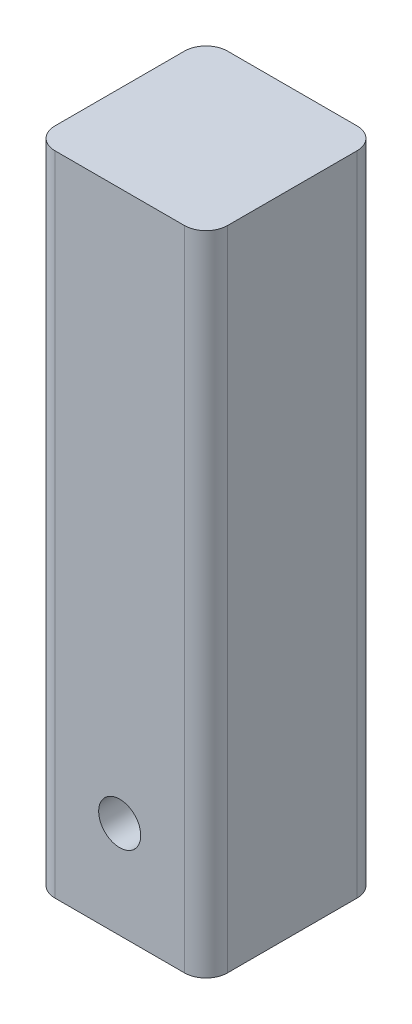
ISO-10303-21;
HEADER;
FILE_DESCRIPTION(('STEP AP214'),'2;1');
FILE_NAME('part.step','',(''),(''),'','','');
FILE_SCHEMA(('AUTOMOTIVE_DESIGN { 1 0 10303 214 1 1 1 1 }'));
ENDSEC;
DATA;
#1=APPLICATION_CONTEXT('core data for automotive mechanical design processes');
#2=APPLICATION_PROTOCOL_DEFINITION('international standard','automotive_design',2000,#1);
#3=PRODUCT_CONTEXT('',#1,'mechanical');
#4=PRODUCT('Part','Part','',(#3));
#5=PRODUCT_RELATED_PRODUCT_CATEGORY('part','',(#4));
#6=PRODUCT_DEFINITION_FORMATION('','',#4);
#7=PRODUCT_DEFINITION_CONTEXT('part definition',#1,'design');
#8=PRODUCT_DEFINITION('design','',#6,#7);
#9=PRODUCT_DEFINITION_SHAPE('','',#8);
#10=(LENGTH_UNIT() NAMED_UNIT(*) SI_UNIT(.MILLI.,.METRE.));
#11=(NAMED_UNIT(*) PLANE_ANGLE_UNIT() SI_UNIT($,.RADIAN.));
#12=(NAMED_UNIT(*) SI_UNIT($,.STERADIAN.) SOLID_ANGLE_UNIT());
#13=UNCERTAINTY_MEASURE_WITH_UNIT(LENGTH_MEASURE(1.E-05),#10,'distance_accuracy_value','');
#14=(GEOMETRIC_REPRESENTATION_CONTEXT(3) GLOBAL_UNCERTAINTY_ASSIGNED_CONTEXT((#13)) GLOBAL_UNIT_ASSIGNED_CONTEXT((#10,
#11,#12)) REPRESENTATION_CONTEXT('',''));
#15=CARTESIAN_POINT('',(0.,0.,0.));
#16=DIRECTION('',(0.,0.,1.));
#17=DIRECTION('',(1.,0.,0.));
#18=AXIS2_PLACEMENT_3D('',#15,#16,#17);
#19=CARTESIAN_POINT('',(-44.8369966945449,120.,-11.4563106796114));
#20=DIRECTION('',(0.,-1.,0.));
#21=DIRECTION('',(0.,0.,-1.));
#22=AXIS2_PLACEMENT_3D('',#19,#20,#21);
#23=CYLINDRICAL_SURFACE('',#22,4.);
#24=CARTESIAN_POINT('',(-44.8369966945449,0.,-11.4563106796114));
#25=DIRECTION('',(0.,1.,0.));
#26=DIRECTION('',(0.,0.,1.));
#27=AXIS2_PLACEMENT_3D('',#24,#25,#26);
#28=CIRCLE('',#27,4.);
#29=CARTESIAN_POINT('',(-44.8369966945449,0.,-15.4563106796114));
#30=VERTEX_POINT('',#29);
#31=CARTESIAN_POINT('',(-48.8369966945449,0.,-11.4563106796114));
#32=VERTEX_POINT('',#31);
#33=EDGE_CURVE('E133',#30,#32,#28,.T.);
#34=ORIENTED_EDGE('',*,*,#33,.T.);
#35=DIRECTION('',(0.,-1.,0.));
#36=VECTOR('',#35,1.);
#37=CARTESIAN_POINT('',(-48.8369966945449,120.,-11.4563106796114));
#38=LINE('',#37,#36);
#39=CARTESIAN_POINT('',(-48.8369966945449,120.,-11.4563106796114));
#40=VERTEX_POINT('',#39);
#41=EDGE_CURVE('E11',#40,#32,#38,.T.);
#42=ORIENTED_EDGE('',*,*,#41,.F.);
#43=CARTESIAN_POINT('',(-44.8369966945449,120.,-11.4563106796114));
#44=DIRECTION('',(0.,1.,0.));
#45=DIRECTION('',(0.,0.,1.));
#46=AXIS2_PLACEMENT_3D('',#43,#44,#45);
#47=CIRCLE('',#46,4.);
#48=CARTESIAN_POINT('',(-44.8369966945449,120.,-15.4563106796114));
#49=VERTEX_POINT('',#48);
#50=EDGE_CURVE('E147',#49,#40,#47,.T.);
#51=ORIENTED_EDGE('',*,*,#50,.F.);
#52=DIRECTION('',(0.,-1.,0.));
#53=VECTOR('',#52,1.);
#54=CARTESIAN_POINT('',(-44.8369966945449,120.,-15.4563106796114));
#55=LINE('',#54,#53);
#56=EDGE_CURVE('E132',#49,#30,#55,.T.);
#57=ORIENTED_EDGE('',*,*,#56,.T.);
#58=EDGE_LOOP('',(#34,#42,#51,#57));
#59=FACE_BOUND('',#58,.T.);
#60=ADVANCED_FACE('F39',(#59),#23,.T.);
#61=CARTESIAN_POINT('',(-48.8369966945449,120.,-11.4563106796114));
#62=DIRECTION('',(1.,0.,0.));
#63=DIRECTION('',(0.,0.,-1.));
#64=AXIS2_PLACEMENT_3D('',#61,#62,#63);
#65=PLANE('',#64);
#66=DIRECTION('',(0.,0.,1.));
#67=VECTOR('',#66,1.);
#68=CARTESIAN_POINT('',(-48.8369966945449,0.,-11.4563106796114));
#69=LINE('',#68,#67);
#70=CARTESIAN_POINT('',(-48.8369966945449,0.,12.5436893203886));
#71=VERTEX_POINT('',#70);
#72=EDGE_CURVE('E139',#32,#71,#69,.T.);
#73=ORIENTED_EDGE('',*,*,#72,.T.);
#74=DIRECTION('',(0.,-1.,0.));
#75=VECTOR('',#74,1.);
#76=CARTESIAN_POINT('',(-48.8369966945449,120.,12.5436893203886));
#77=LINE('',#76,#75);
#78=CARTESIAN_POINT('',(-48.8369966945449,120.,12.5436893203886));
#79=VERTEX_POINT('',#78);
#80=EDGE_CURVE('E50',#79,#71,#77,.T.);
#81=ORIENTED_EDGE('',*,*,#80,.F.);
#82=DIRECTION('',(0.,0.,1.));
#83=VECTOR('',#82,1.);
#84=CARTESIAN_POINT('',(-48.8369966945449,120.,-11.4563106796114));
#85=LINE('',#84,#83);
#86=EDGE_CURVE('E98',#40,#79,#85,.T.);
#87=ORIENTED_EDGE('',*,*,#86,.F.);
#88=ORIENTED_EDGE('',*,*,#41,.T.);
#89=EDGE_LOOP('',(#73,#81,#87,#88));
#90=FACE_BOUND('',#89,.T.);
#91=ADVANCED_FACE('F206',(#90),#65,.F.);
#92=CARTESIAN_POINT('',(-44.8369966945449,120.,12.5436893203886));
#93=DIRECTION('',(0.,-1.,0.));
#94=DIRECTION('',(0.,0.,-1.));
#95=AXIS2_PLACEMENT_3D('',#92,#93,#94);
#96=CYLINDRICAL_SURFACE('',#95,4.);
#97=CARTESIAN_POINT('',(-44.8369966945449,0.,12.5436893203886));
#98=DIRECTION('',(0.,1.,0.));
#99=DIRECTION('',(0.,0.,1.));
#100=AXIS2_PLACEMENT_3D('',#97,#98,#99);
#101=CIRCLE('',#100,4.);
#102=CARTESIAN_POINT('',(-44.8369966945449,0.,16.5436893203886));
#103=VERTEX_POINT('',#102);
#104=EDGE_CURVE('E143',#71,#103,#101,.T.);
#105=ORIENTED_EDGE('',*,*,#104,.T.);
#106=DIRECTION('',(0.,-1.,0.));
#107=VECTOR('',#106,1.);
#108=CARTESIAN_POINT('',(-44.8369966945449,120.,16.5436893203886));
#109=LINE('',#108,#107);
#110=CARTESIAN_POINT('',(-44.8369966945449,120.,16.5436893203886));
#111=VERTEX_POINT('',#110);
#112=EDGE_CURVE('E160',#111,#103,#109,.T.);
#113=ORIENTED_EDGE('',*,*,#112,.F.);
#114=CARTESIAN_POINT('',(-44.8369966945449,120.,12.5436893203886));
#115=DIRECTION('',(0.,1.,0.));
#116=DIRECTION('',(0.,0.,1.));
#117=AXIS2_PLACEMENT_3D('',#114,#115,#116);
#118=CIRCLE('',#117,4.);
#119=EDGE_CURVE('E164',#79,#111,#118,.T.);
#120=ORIENTED_EDGE('',*,*,#119,.F.);
#121=ORIENTED_EDGE('',*,*,#80,.T.);
#122=EDGE_LOOP('',(#105,#113,#120,#121));
#123=FACE_BOUND('',#122,.T.);
#124=ADVANCED_FACE('F162',(#123),#96,.T.);
#125=CARTESIAN_POINT('',(-44.8369966945449,120.,16.5436893203886));
#126=DIRECTION('',(0.,0.,-1.));
#127=DIRECTION('',(-1.,0.,0.));
#128=AXIS2_PLACEMENT_3D('',#125,#126,#127);
#129=PLANE('',#128);
#130=CARTESIAN_POINT('',(-32.8369966945449,18.,16.5436893203886));
#131=DIRECTION('',(0.,0.,1.));
#132=DIRECTION('',(1.,0.,0.));
#133=AXIS2_PLACEMENT_3D('',#130,#131,#132);
#134=CIRCLE('',#133,3.9);
#135=CARTESIAN_POINT('',(-28.9369966945449,18.,16.5436893203886));
#136=VERTEX_POINT('',#135);
#137=EDGE_CURVE('E181',#136,#136,#134,.T.);
#138=ORIENTED_EDGE('',*,*,#137,.F.);
#139=EDGE_LOOP('',(#138));
#140=FACE_BOUND('',#139,.T.);
#141=DIRECTION('',(1.,0.,0.));
#142=VECTOR('',#141,1.);
#143=CARTESIAN_POINT('',(-44.8369966945449,0.,16.5436893203886));
#144=LINE('',#143,#142);
#145=CARTESIAN_POINT('',(-20.836996694545,0.,16.5436893203886));
#146=VERTEX_POINT('',#145);
#147=EDGE_CURVE('E141',#103,#146,#144,.T.);
#148=ORIENTED_EDGE('',*,*,#147,.T.);
#149=DIRECTION('',(0.,-1.,0.));
#150=VECTOR('',#149,1.);
#151=CARTESIAN_POINT('',(-20.836996694545,120.,16.5436893203886));
#152=LINE('',#151,#150);
#153=CARTESIAN_POINT('',(-20.836996694545,120.,16.5436893203886));
#154=VERTEX_POINT('',#153);
#155=EDGE_CURVE('E152',#154,#146,#152,.T.);
#156=ORIENTED_EDGE('',*,*,#155,.F.);
#157=DIRECTION('',(1.,0.,0.));
#158=VECTOR('',#157,1.);
#159=CARTESIAN_POINT('',(-44.8369966945449,120.,16.5436893203886));
#160=LINE('',#159,#158);
#161=EDGE_CURVE('E180',#111,#154,#160,.T.);
#162=ORIENTED_EDGE('',*,*,#161,.F.);
#163=ORIENTED_EDGE('',*,*,#112,.T.);
#164=EDGE_LOOP('',(#148,#156,#162,#163));
#165=FACE_BOUND('',#164,.T.);
#166=ADVANCED_FACE('F174',(#140,#165),#129,.F.);
#167=CARTESIAN_POINT('',(-20.8369966945449,120.,12.5436893203886));
#168=DIRECTION('',(0.,-1.,0.));
#169=DIRECTION('',(0.,0.,-1.));
#170=AXIS2_PLACEMENT_3D('',#167,#168,#169);
#171=CYLINDRICAL_SURFACE('',#170,4.);
#172=CARTESIAN_POINT('',(-20.8369966945449,0.,12.5436893203886));
#173=DIRECTION('',(0.,1.,0.));
#174=DIRECTION('',(0.,0.,-1.));
#175=AXIS2_PLACEMENT_3D('',#172,#173,#174);
#176=CIRCLE('',#175,4.);
#177=CARTESIAN_POINT('',(-16.8369966945449,0.,12.5436893203886));
#178=VERTEX_POINT('',#177);
#179=EDGE_CURVE('E144',#146,#178,#176,.T.);
#180=ORIENTED_EDGE('',*,*,#179,.T.);
#181=DIRECTION('',(0.,-1.,0.));
#182=VECTOR('',#181,1.);
#183=CARTESIAN_POINT('',(-16.8369966945449,120.,12.5436893203886));
#184=LINE('',#183,#182);
#185=CARTESIAN_POINT('',(-16.8369966945449,120.,12.5436893203886));
#186=VERTEX_POINT('',#185);
#187=EDGE_CURVE('E127',#186,#178,#184,.T.);
#188=ORIENTED_EDGE('',*,*,#187,.F.);
#189=CARTESIAN_POINT('',(-20.8369966945449,120.,12.5436893203886));
#190=DIRECTION('',(0.,1.,0.));
#191=DIRECTION('',(0.,0.,-1.));
#192=AXIS2_PLACEMENT_3D('',#189,#190,#191);
#193=CIRCLE('',#192,4.);
#194=EDGE_CURVE('E120',#154,#186,#193,.T.);
#195=ORIENTED_EDGE('',*,*,#194,.F.);
#196=ORIENTED_EDGE('',*,*,#155,.T.);
#197=EDGE_LOOP('',(#180,#188,#195,#196));
#198=FACE_BOUND('',#197,.T.);
#199=ADVANCED_FACE('F177',(#198),#171,.T.);
#200=CARTESIAN_POINT('',(-16.8369966945449,120.,-11.4563106796114));
#201=DIRECTION('',(-1.,0.,0.));
#202=DIRECTION('',(0.,0.,1.));
#203=AXIS2_PLACEMENT_3D('',#200,#201,#202);
#204=PLANE('',#203);
#205=DIRECTION('',(0.,0.,-1.));
#206=VECTOR('',#205,1.);
#207=CARTESIAN_POINT('',(-16.8369966945449,0.,-11.4563106796114));
#208=LINE('',#207,#206);
#209=CARTESIAN_POINT('',(-16.8369966945449,0.,-11.4563106796114));
#210=VERTEX_POINT('',#209);
#211=EDGE_CURVE('E123',#178,#210,#208,.T.);
#212=ORIENTED_EDGE('',*,*,#211,.T.);
#213=DIRECTION('',(0.,-1.,0.));
#214=VECTOR('',#213,1.);
#215=CARTESIAN_POINT('',(-16.8369966945449,120.,-11.4563106796114));
#216=LINE('',#215,#214);
#217=CARTESIAN_POINT('',(-16.8369966945449,120.,-11.4563106796114));
#218=VERTEX_POINT('',#217);
#219=EDGE_CURVE('E125',#218,#210,#216,.T.);
#220=ORIENTED_EDGE('',*,*,#219,.F.);
#221=DIRECTION('',(0.,0.,-1.));
#222=VECTOR('',#221,1.);
#223=CARTESIAN_POINT('',(-16.8369966945449,120.,-11.4563106796114));
#224=LINE('',#223,#222);
#225=EDGE_CURVE('E112',#186,#218,#224,.T.);
#226=ORIENTED_EDGE('',*,*,#225,.F.);
#227=ORIENTED_EDGE('',*,*,#187,.T.);
#228=EDGE_LOOP('',(#212,#220,#226,#227));
#229=FACE_BOUND('',#228,.T.);
#230=ADVANCED_FACE('F124',(#229),#204,.F.);
#231=CARTESIAN_POINT('',(-20.8369966945449,120.,-11.4563106796114));
#232=DIRECTION('',(0.,-1.,0.));
#233=DIRECTION('',(0.,0.,-1.));
#234=AXIS2_PLACEMENT_3D('',#231,#232,#233);
#235=CYLINDRICAL_SURFACE('',#234,4.);
#236=CARTESIAN_POINT('',(-20.8369966945449,0.,-11.4563106796114));
#237=DIRECTION('',(0.,1.,0.));
#238=DIRECTION('',(0.,0.,1.));
#239=AXIS2_PLACEMENT_3D('',#236,#237,#238);
#240=CIRCLE('',#239,4.);
#241=CARTESIAN_POINT('',(-20.836996694545,0.,-15.4563106796114));
#242=VERTEX_POINT('',#241);
#243=EDGE_CURVE('E81',#210,#242,#240,.T.);
#244=ORIENTED_EDGE('',*,*,#243,.T.);
#245=DIRECTION('',(0.,-1.,0.));
#246=VECTOR('',#245,1.);
#247=CARTESIAN_POINT('',(-20.836996694545,120.,-15.4563106796114));
#248=LINE('',#247,#246);
#249=CARTESIAN_POINT('',(-20.836996694545,120.,-15.4563106796114));
#250=VERTEX_POINT('',#249);
#251=EDGE_CURVE('E130',#250,#242,#248,.T.);
#252=ORIENTED_EDGE('',*,*,#251,.F.);
#253=CARTESIAN_POINT('',(-20.8369966945449,120.,-11.4563106796114));
#254=DIRECTION('',(0.,1.,0.));
#255=DIRECTION('',(0.,0.,1.));
#256=AXIS2_PLACEMENT_3D('',#253,#254,#255);
#257=CIRCLE('',#256,4.);
#258=EDGE_CURVE('E113',#218,#250,#257,.T.);
#259=ORIENTED_EDGE('',*,*,#258,.F.);
#260=ORIENTED_EDGE('',*,*,#219,.T.);
#261=EDGE_LOOP('',(#244,#252,#259,#260));
#262=FACE_BOUND('',#261,.T.);
#263=ADVANCED_FACE('F129',(#262),#235,.T.);
#264=CARTESIAN_POINT('',(-44.8369966945449,120.,-15.4563106796114));
#265=DIRECTION('',(0.,0.,1.));
#266=DIRECTION('',(1.,0.,0.));
#267=AXIS2_PLACEMENT_3D('',#264,#265,#266);
#268=PLANE('',#267);
#269=CARTESIAN_POINT('',(-32.8369966945449,18.,-15.4563106796114));
#270=DIRECTION('',(0.,0.,1.));
#271=DIRECTION('',(1.,0.,0.));
#272=AXIS2_PLACEMENT_3D('',#269,#270,#271);
#273=CIRCLE('',#272,3.9);
#274=CARTESIAN_POINT('',(-28.9369966945449,18.,-15.4563106796114));
#275=VERTEX_POINT('',#274);
#276=EDGE_CURVE('E136',#275,#275,#273,.T.);
#277=ORIENTED_EDGE('',*,*,#276,.T.);
#278=EDGE_LOOP('',(#277));
#279=FACE_BOUND('',#278,.T.);
#280=DIRECTION('',(-1.,0.,0.));
#281=VECTOR('',#280,1.);
#282=CARTESIAN_POINT('',(-44.8369966945449,0.,-15.4563106796114));
#283=LINE('',#282,#281);
#284=EDGE_CURVE('E89',#242,#30,#283,.T.);
#285=ORIENTED_EDGE('',*,*,#284,.T.);
#286=ORIENTED_EDGE('',*,*,#56,.F.);
#287=DIRECTION('',(-1.,0.,0.));
#288=VECTOR('',#287,1.);
#289=CARTESIAN_POINT('',(-44.8369966945449,120.,-15.4563106796114));
#290=LINE('',#289,#288);
#291=EDGE_CURVE('E54',#250,#49,#290,.T.);
#292=ORIENTED_EDGE('',*,*,#291,.F.);
#293=ORIENTED_EDGE('',*,*,#251,.T.);
#294=EDGE_LOOP('',(#285,#286,#292,#293));
#295=FACE_BOUND('',#294,.T.);
#296=ADVANCED_FACE('F186',(#279,#295),#268,.F.);
#297=CARTESIAN_POINT('',(-44.8369966945449,120.,-11.4563106796114));
#298=DIRECTION('',(0.,1.,0.));
#299=DIRECTION('',(0.,0.,1.));
#300=AXIS2_PLACEMENT_3D('',#297,#298,#299);
#301=PLANE('',#300);
#302=ORIENTED_EDGE('',*,*,#50,.T.);
#303=ORIENTED_EDGE('',*,*,#86,.T.);
#304=ORIENTED_EDGE('',*,*,#119,.T.);
#305=ORIENTED_EDGE('',*,*,#161,.T.);
#306=ORIENTED_EDGE('',*,*,#194,.T.);
#307=ORIENTED_EDGE('',*,*,#225,.T.);
#308=ORIENTED_EDGE('',*,*,#258,.T.);
#309=ORIENTED_EDGE('',*,*,#291,.T.);
#310=EDGE_LOOP('',(#302,#303,#304,#305,#306,#307,#308,#309));
#311=FACE_BOUND('',#310,.T.);
#312=ADVANCED_FACE('F114',(#311),#301,.T.);
#313=CARTESIAN_POINT('',(-44.8369966945449,0.,-11.4563106796114));
#314=DIRECTION('',(0.,1.,0.));
#315=DIRECTION('',(0.,0.,1.));
#316=AXIS2_PLACEMENT_3D('',#313,#314,#315);
#317=PLANE('',#316);
#318=ORIENTED_EDGE('',*,*,#33,.F.);
#319=ORIENTED_EDGE('',*,*,#284,.F.);
#320=ORIENTED_EDGE('',*,*,#243,.F.);
#321=ORIENTED_EDGE('',*,*,#211,.F.);
#322=ORIENTED_EDGE('',*,*,#179,.F.);
#323=ORIENTED_EDGE('',*,*,#147,.F.);
#324=ORIENTED_EDGE('',*,*,#104,.F.);
#325=ORIENTED_EDGE('',*,*,#72,.F.);
#326=EDGE_LOOP('',(#318,#319,#320,#321,#322,#323,#324,#325));
#327=FACE_BOUND('',#326,.T.);
#328=ADVANCED_FACE('F166',(#327),#317,.F.);
#329=CARTESIAN_POINT('',(-32.8369966945449,18.,-15.4563106796114));
#330=DIRECTION('',(0.,0.,1.));
#331=DIRECTION('',(1.,0.,0.));
#332=AXIS2_PLACEMENT_3D('',#329,#330,#331);
#333=CYLINDRICAL_SURFACE('',#332,3.9);
#334=ORIENTED_EDGE('',*,*,#276,.F.);
#335=EDGE_LOOP('',(#334));
#336=FACE_BOUND('',#335,.T.);
#337=ORIENTED_EDGE('',*,*,#137,.T.);
#338=EDGE_LOOP('',(#337));
#339=FACE_BOUND('',#338,.T.);
#340=ADVANCED_FACE('F192',(#336,#339),#333,.F.);
#341=CLOSED_SHELL('',(#60,#91,#124,#166,#199,#230,#263,#296,#312,#328,#340));
#342=MANIFOLD_SOLID_BREP('B2',#341);
#343=ADVANCED_BREP_SHAPE_REPRESENTATION('',(#18,#342),#14);
#344=SHAPE_DEFINITION_REPRESENTATION(#9,#343);
ENDSEC;
END-ISO-10303-21;
